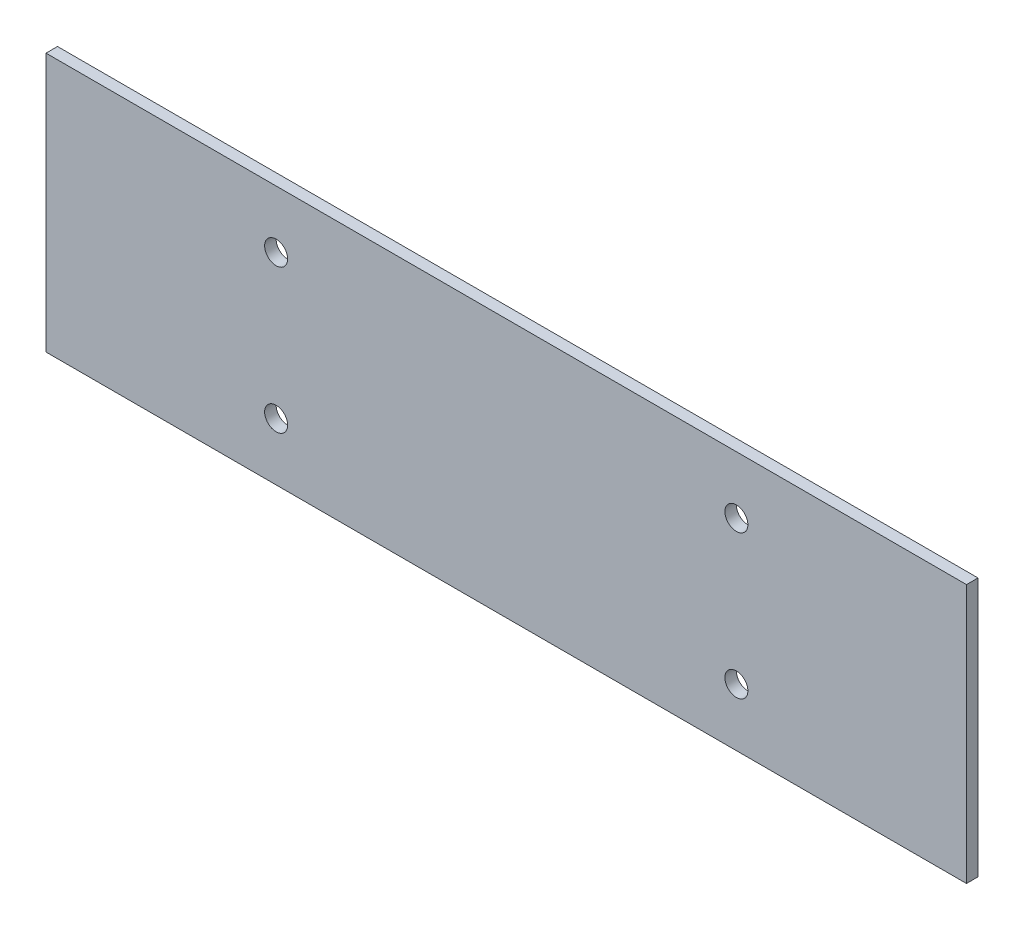
ISO-10303-21;
HEADER;
FILE_DESCRIPTION(('STEP AP214'),'2;1');
FILE_NAME('part.step','',(''),(''),'','','');
FILE_SCHEMA(('AUTOMOTIVE_DESIGN { 1 0 10303 214 1 1 1 1 }'));
ENDSEC;
DATA;
#1=APPLICATION_CONTEXT('core data for automotive mechanical design processes');
#2=APPLICATION_PROTOCOL_DEFINITION('international standard','automotive_design',2000,#1);
#3=PRODUCT_CONTEXT('',#1,'mechanical');
#4=PRODUCT('Part','Part','',(#3));
#5=PRODUCT_RELATED_PRODUCT_CATEGORY('part','',(#4));
#6=PRODUCT_DEFINITION_FORMATION('','',#4);
#7=PRODUCT_DEFINITION_CONTEXT('part definition',#1,'design');
#8=PRODUCT_DEFINITION('design','',#6,#7);
#9=PRODUCT_DEFINITION_SHAPE('','',#8);
#10=(LENGTH_UNIT() NAMED_UNIT(*) SI_UNIT(.MILLI.,.METRE.));
#11=(NAMED_UNIT(*) PLANE_ANGLE_UNIT() SI_UNIT($,.RADIAN.));
#12=(NAMED_UNIT(*) SI_UNIT($,.STERADIAN.) SOLID_ANGLE_UNIT());
#13=UNCERTAINTY_MEASURE_WITH_UNIT(LENGTH_MEASURE(1.E-05),#10,'distance_accuracy_value','');
#14=(GEOMETRIC_REPRESENTATION_CONTEXT(3) GLOBAL_UNCERTAINTY_ASSIGNED_CONTEXT((#13)) GLOBAL_UNIT_ASSIGNED_CONTEXT((#10,
#11,#12)) REPRESENTATION_CONTEXT('',''));
#15=CARTESIAN_POINT('',(0.,0.,0.));
#16=DIRECTION('',(0.,0.,1.));
#17=DIRECTION('',(1.,0.,0.));
#18=AXIS2_PLACEMENT_3D('',#15,#16,#17);
#19=CARTESIAN_POINT('',(0.,0.,2.));
#20=DIRECTION('',(0.,0.,-1.));
#21=DIRECTION('',(-1.,0.,0.));
#22=AXIS2_PLACEMENT_3D('',#19,#20,#21);
#23=PLANE('',#22);
#24=DIRECTION('',(0.,-1.,0.));
#25=VECTOR('',#24,1.);
#26=CARTESIAN_POINT('',(0.,0.,2.));
#27=LINE('',#26,#25);
#28=CARTESIAN_POINT('',(0.,45.,2.));
#29=VERTEX_POINT('',#28);
#30=CARTESIAN_POINT('',(0.,0.,2.));
#31=VERTEX_POINT('',#30);
#32=EDGE_CURVE('E92',#29,#31,#27,.T.);
#33=ORIENTED_EDGE('',*,*,#32,.T.);
#34=DIRECTION('',(1.,0.,0.));
#35=VECTOR('',#34,1.);
#36=CARTESIAN_POINT('',(0.,0.,2.));
#37=LINE('',#36,#35);
#38=CARTESIAN_POINT('',(160.,0.,2.));
#39=VERTEX_POINT('',#38);
#40=EDGE_CURVE('E87',#31,#39,#37,.T.);
#41=ORIENTED_EDGE('',*,*,#40,.T.);
#42=DIRECTION('',(0.,1.,0.));
#43=VECTOR('',#42,1.);
#44=CARTESIAN_POINT('',(160.,0.,2.));
#45=LINE('',#44,#43);
#46=CARTESIAN_POINT('',(160.,45.,2.));
#47=VERTEX_POINT('',#46);
#48=EDGE_CURVE('E90',#39,#47,#45,.T.);
#49=ORIENTED_EDGE('',*,*,#48,.T.);
#50=DIRECTION('',(-1.,0.,0.));
#51=VECTOR('',#50,1.);
#52=CARTESIAN_POINT('',(0.,45.,2.));
#53=LINE('',#52,#51);
#54=EDGE_CURVE('E57',#47,#29,#53,.T.);
#55=ORIENTED_EDGE('',*,*,#54,.T.);
#56=EDGE_LOOP('',(#33,#41,#49,#55));
#57=FACE_BOUND('',#56,.T.);
#58=CARTESIAN_POINT('',(40.,35.,2.));
#59=DIRECTION('',(0.,0.,1.));
#60=DIRECTION('',(1.,0.,0.));
#61=AXIS2_PLACEMENT_3D('',#58,#59,#60);
#62=CIRCLE('',#61,2.);
#63=CARTESIAN_POINT('',(42.,35.,2.));
#64=VERTEX_POINT('',#63);
#65=EDGE_CURVE('E112',#64,#64,#62,.T.);
#66=ORIENTED_EDGE('',*,*,#65,.F.);
#67=EDGE_LOOP('',(#66));
#68=FACE_BOUND('',#67,.T.);
#69=CARTESIAN_POINT('',(120.,35.,2.));
#70=DIRECTION('',(0.,0.,1.));
#71=DIRECTION('',(1.,0.,0.));
#72=AXIS2_PLACEMENT_3D('',#69,#70,#71);
#73=CIRCLE('',#72,2.);
#74=CARTESIAN_POINT('',(122.,35.,2.));
#75=VERTEX_POINT('',#74);
#76=EDGE_CURVE('E134',#75,#75,#73,.T.);
#77=ORIENTED_EDGE('',*,*,#76,.F.);
#78=EDGE_LOOP('',(#77));
#79=FACE_BOUND('',#78,.T.);
#80=CARTESIAN_POINT('',(40.,9.99999999999999,2.));
#81=DIRECTION('',(0.,0.,1.));
#82=DIRECTION('',(1.,0.,0.));
#83=AXIS2_PLACEMENT_3D('',#80,#81,#82);
#84=CIRCLE('',#83,2.);
#85=CARTESIAN_POINT('',(42.,9.99999999999999,2.));
#86=VERTEX_POINT('',#85);
#87=EDGE_CURVE('E142',#86,#86,#84,.T.);
#88=ORIENTED_EDGE('',*,*,#87,.F.);
#89=EDGE_LOOP('',(#88));
#90=FACE_BOUND('',#89,.T.);
#91=CARTESIAN_POINT('',(120.,9.99999999999999,2.));
#92=DIRECTION('',(0.,0.,1.));
#93=DIRECTION('',(1.,0.,0.));
#94=AXIS2_PLACEMENT_3D('',#91,#92,#93);
#95=CIRCLE('',#94,2.);
#96=CARTESIAN_POINT('',(122.,9.99999999999999,2.));
#97=VERTEX_POINT('',#96);
#98=EDGE_CURVE('E150',#97,#97,#95,.T.);
#99=ORIENTED_EDGE('',*,*,#98,.F.);
#100=EDGE_LOOP('',(#99));
#101=FACE_BOUND('',#100,.T.);
#102=ADVANCED_FACE('F39',(#57,#68,#79,#90,#101),#23,.F.);
#103=CARTESIAN_POINT('',(0.,0.,0.));
#104=DIRECTION('',(0.,0.,-1.));
#105=DIRECTION('',(-1.,0.,0.));
#106=AXIS2_PLACEMENT_3D('',#103,#104,#105);
#107=PLANE('',#106);
#108=CARTESIAN_POINT('',(40.,9.99999999999999,0.));
#109=DIRECTION('',(0.,0.,1.));
#110=DIRECTION('',(1.,0.,0.));
#111=AXIS2_PLACEMENT_3D('',#108,#109,#110);
#112=CIRCLE('',#111,2.);
#113=CARTESIAN_POINT('',(42.,9.99999999999999,0.));
#114=VERTEX_POINT('',#113);
#115=EDGE_CURVE('E146',#114,#114,#112,.T.);
#116=ORIENTED_EDGE('',*,*,#115,.T.);
#117=EDGE_LOOP('',(#116));
#118=FACE_BOUND('',#117,.T.);
#119=CARTESIAN_POINT('',(40.,35.,0.));
#120=DIRECTION('',(0.,0.,1.));
#121=DIRECTION('',(1.,0.,0.));
#122=AXIS2_PLACEMENT_3D('',#119,#120,#121);
#123=CIRCLE('',#122,2.);
#124=CARTESIAN_POINT('',(42.,35.,0.));
#125=VERTEX_POINT('',#124);
#126=EDGE_CURVE('E130',#125,#125,#123,.T.);
#127=ORIENTED_EDGE('',*,*,#126,.T.);
#128=EDGE_LOOP('',(#127));
#129=FACE_BOUND('',#128,.T.);
#130=DIRECTION('',(0.,-1.,0.));
#131=VECTOR('',#130,1.);
#132=CARTESIAN_POINT('',(0.,0.,0.));
#133=LINE('',#132,#131);
#134=CARTESIAN_POINT('',(0.,45.,0.));
#135=VERTEX_POINT('',#134);
#136=CARTESIAN_POINT('',(0.,0.,0.));
#137=VERTEX_POINT('',#136);
#138=EDGE_CURVE('E108',#135,#137,#133,.T.);
#139=ORIENTED_EDGE('',*,*,#138,.F.);
#140=DIRECTION('',(-1.,0.,0.));
#141=VECTOR('',#140,1.);
#142=CARTESIAN_POINT('',(0.,45.,0.));
#143=LINE('',#142,#141);
#144=CARTESIAN_POINT('',(160.,45.,0.));
#145=VERTEX_POINT('',#144);
#146=EDGE_CURVE('E80',#145,#135,#143,.T.);
#147=ORIENTED_EDGE('',*,*,#146,.F.);
#148=DIRECTION('',(0.,1.,0.));
#149=VECTOR('',#148,1.);
#150=CARTESIAN_POINT('',(160.,0.,0.));
#151=LINE('',#150,#149);
#152=CARTESIAN_POINT('',(160.,0.,0.));
#153=VERTEX_POINT('',#152);
#154=EDGE_CURVE('E74',#153,#145,#151,.T.);
#155=ORIENTED_EDGE('',*,*,#154,.F.);
#156=DIRECTION('',(1.,0.,0.));
#157=VECTOR('',#156,1.);
#158=CARTESIAN_POINT('',(0.,0.,0.));
#159=LINE('',#158,#157);
#160=EDGE_CURVE('E97',#137,#153,#159,.T.);
#161=ORIENTED_EDGE('',*,*,#160,.F.);
#162=EDGE_LOOP('',(#139,#147,#155,#161));
#163=FACE_BOUND('',#162,.T.);
#164=CARTESIAN_POINT('',(120.,35.,0.));
#165=DIRECTION('',(0.,0.,1.));
#166=DIRECTION('',(1.,0.,0.));
#167=AXIS2_PLACEMENT_3D('',#164,#165,#166);
#168=CIRCLE('',#167,2.);
#169=CARTESIAN_POINT('',(122.,35.,0.));
#170=VERTEX_POINT('',#169);
#171=EDGE_CURVE('E138',#170,#170,#168,.T.);
#172=ORIENTED_EDGE('',*,*,#171,.T.);
#173=EDGE_LOOP('',(#172));
#174=FACE_BOUND('',#173,.T.);
#175=CARTESIAN_POINT('',(120.,9.99999999999999,0.));
#176=DIRECTION('',(0.,0.,1.));
#177=DIRECTION('',(1.,0.,0.));
#178=AXIS2_PLACEMENT_3D('',#175,#176,#177);
#179=CIRCLE('',#178,2.);
#180=CARTESIAN_POINT('',(122.,9.99999999999999,0.));
#181=VERTEX_POINT('',#180);
#182=EDGE_CURVE('E154',#181,#181,#179,.T.);
#183=ORIENTED_EDGE('',*,*,#182,.T.);
#184=EDGE_LOOP('',(#183));
#185=FACE_BOUND('',#184,.T.);
#186=ADVANCED_FACE('F125',(#118,#129,#163,#174,#185),#107,.T.);
#187=CARTESIAN_POINT('',(0.,0.,2.));
#188=DIRECTION('',(1.,0.,0.));
#189=DIRECTION('',(0.,0.,-1.));
#190=AXIS2_PLACEMENT_3D('',#187,#188,#189);
#191=PLANE('',#190);
#192=ORIENTED_EDGE('',*,*,#138,.T.);
#193=DIRECTION('',(0.,0.,-1.));
#194=VECTOR('',#193,1.);
#195=CARTESIAN_POINT('',(0.,0.,2.));
#196=LINE('',#195,#194);
#197=EDGE_CURVE('E11',#31,#137,#196,.T.);
#198=ORIENTED_EDGE('',*,*,#197,.F.);
#199=ORIENTED_EDGE('',*,*,#32,.F.);
#200=DIRECTION('',(0.,0.,-1.));
#201=VECTOR('',#200,1.);
#202=CARTESIAN_POINT('',(0.,45.,2.));
#203=LINE('',#202,#201);
#204=EDGE_CURVE('E104',#29,#135,#203,.T.);
#205=ORIENTED_EDGE('',*,*,#204,.T.);
#206=EDGE_LOOP('',(#192,#198,#199,#205));
#207=FACE_BOUND('',#206,.T.);
#208=ADVANCED_FACE('F41',(#207),#191,.F.);
#209=CARTESIAN_POINT('',(0.,0.,2.));
#210=DIRECTION('',(0.,1.,0.));
#211=DIRECTION('',(0.,0.,1.));
#212=AXIS2_PLACEMENT_3D('',#209,#210,#211);
#213=PLANE('',#212);
#214=ORIENTED_EDGE('',*,*,#160,.T.);
#215=DIRECTION('',(0.,0.,-1.));
#216=VECTOR('',#215,1.);
#217=CARTESIAN_POINT('',(160.,0.,2.));
#218=LINE('',#217,#216);
#219=EDGE_CURVE('E49',#39,#153,#218,.T.);
#220=ORIENTED_EDGE('',*,*,#219,.F.);
#221=ORIENTED_EDGE('',*,*,#40,.F.);
#222=ORIENTED_EDGE('',*,*,#197,.T.);
#223=EDGE_LOOP('',(#214,#220,#221,#222));
#224=FACE_BOUND('',#223,.T.);
#225=ADVANCED_FACE('F96',(#224),#213,.F.);
#226=CARTESIAN_POINT('',(160.,0.,2.));
#227=DIRECTION('',(-1.,0.,0.));
#228=DIRECTION('',(0.,0.,1.));
#229=AXIS2_PLACEMENT_3D('',#226,#227,#228);
#230=PLANE('',#229);
#231=ORIENTED_EDGE('',*,*,#154,.T.);
#232=DIRECTION('',(0.,0.,-1.));
#233=VECTOR('',#232,1.);
#234=CARTESIAN_POINT('',(160.,45.,2.));
#235=LINE('',#234,#233);
#236=EDGE_CURVE('E99',#47,#145,#235,.T.);
#237=ORIENTED_EDGE('',*,*,#236,.F.);
#238=ORIENTED_EDGE('',*,*,#48,.F.);
#239=ORIENTED_EDGE('',*,*,#219,.T.);
#240=EDGE_LOOP('',(#231,#237,#238,#239));
#241=FACE_BOUND('',#240,.T.);
#242=ADVANCED_FACE('F100',(#241),#230,.F.);
#243=CARTESIAN_POINT('',(0.,45.,2.));
#244=DIRECTION('',(0.,-1.,0.));
#245=DIRECTION('',(0.,0.,-1.));
#246=AXIS2_PLACEMENT_3D('',#243,#244,#245);
#247=PLANE('',#246);
#248=ORIENTED_EDGE('',*,*,#146,.T.);
#249=ORIENTED_EDGE('',*,*,#204,.F.);
#250=ORIENTED_EDGE('',*,*,#54,.F.);
#251=ORIENTED_EDGE('',*,*,#236,.T.);
#252=EDGE_LOOP('',(#248,#249,#250,#251));
#253=FACE_BOUND('',#252,.T.);
#254=ADVANCED_FACE('F122',(#253),#247,.F.);
#255=CARTESIAN_POINT('',(40.,35.,2.));
#256=DIRECTION('',(0.,0.,-1.));
#257=DIRECTION('',(-1.,0.,0.));
#258=AXIS2_PLACEMENT_3D('',#255,#256,#257);
#259=CYLINDRICAL_SURFACE('',#258,2.);
#260=ORIENTED_EDGE('',*,*,#65,.T.);
#261=EDGE_LOOP('',(#260));
#262=FACE_BOUND('',#261,.T.);
#263=ORIENTED_EDGE('',*,*,#126,.F.);
#264=EDGE_LOOP('',(#263));
#265=FACE_BOUND('',#264,.T.);
#266=ADVANCED_FACE('F173',(#262,#265),#259,.F.);
#267=CARTESIAN_POINT('',(120.,35.,2.));
#268=DIRECTION('',(0.,0.,-1.));
#269=DIRECTION('',(-1.,0.,0.));
#270=AXIS2_PLACEMENT_3D('',#267,#268,#269);
#271=CYLINDRICAL_SURFACE('',#270,2.);
#272=ORIENTED_EDGE('',*,*,#76,.T.);
#273=EDGE_LOOP('',(#272));
#274=FACE_BOUND('',#273,.T.);
#275=ORIENTED_EDGE('',*,*,#171,.F.);
#276=EDGE_LOOP('',(#275));
#277=FACE_BOUND('',#276,.T.);
#278=ADVANCED_FACE('F219',(#274,#277),#271,.F.);
#279=CARTESIAN_POINT('',(40.,9.99999999999999,2.));
#280=DIRECTION('',(0.,0.,-1.));
#281=DIRECTION('',(-1.,0.,0.));
#282=AXIS2_PLACEMENT_3D('',#279,#280,#281);
#283=CYLINDRICAL_SURFACE('',#282,2.);
#284=ORIENTED_EDGE('',*,*,#87,.T.);
#285=EDGE_LOOP('',(#284));
#286=FACE_BOUND('',#285,.T.);
#287=ORIENTED_EDGE('',*,*,#115,.F.);
#288=EDGE_LOOP('',(#287));
#289=FACE_BOUND('',#288,.T.);
#290=ADVANCED_FACE('F227',(#286,#289),#283,.F.);
#291=CARTESIAN_POINT('',(120.,9.99999999999999,2.));
#292=DIRECTION('',(0.,0.,-1.));
#293=DIRECTION('',(-1.,0.,0.));
#294=AXIS2_PLACEMENT_3D('',#291,#292,#293);
#295=CYLINDRICAL_SURFACE('',#294,2.);
#296=ORIENTED_EDGE('',*,*,#98,.T.);
#297=EDGE_LOOP('',(#296));
#298=FACE_BOUND('',#297,.T.);
#299=ORIENTED_EDGE('',*,*,#182,.F.);
#300=EDGE_LOOP('',(#299));
#301=FACE_BOUND('',#300,.T.);
#302=ADVANCED_FACE('F162',(#298,#301),#295,.F.);
#303=CLOSED_SHELL('',(#102,#186,#208,#225,#242,#254,#266,#278,#290,#302));
#304=MANIFOLD_SOLID_BREP('B2',#303);
#305=ADVANCED_BREP_SHAPE_REPRESENTATION('',(#18,#304),#14);
#306=SHAPE_DEFINITION_REPRESENTATION(#9,#305);
ENDSEC;
END-ISO-10303-21;
